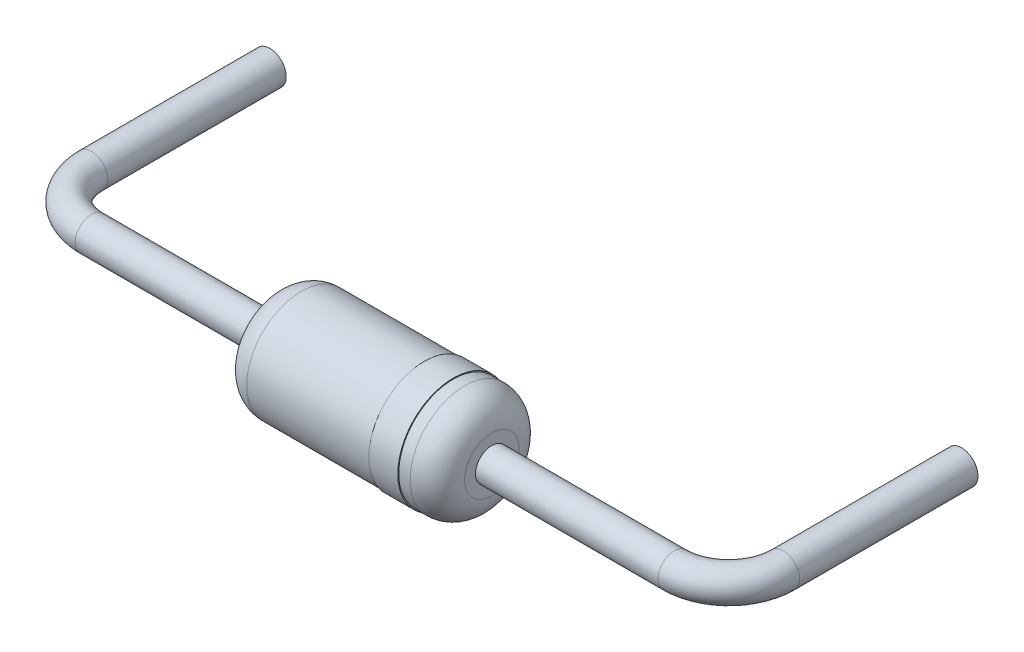
ISO-10303-21;
HEADER;
FILE_DESCRIPTION(('STEP AP214'),'2;1');
FILE_NAME('part.step','',(''),(''),'','','');
FILE_SCHEMA(('AUTOMOTIVE_DESIGN { 1 0 10303 214 1 1 1 1 }'));
ENDSEC;
DATA;
#1=APPLICATION_CONTEXT('core data for automotive mechanical design processes');
#2=APPLICATION_PROTOCOL_DEFINITION('international standard','automotive_design',2000,#1);
#3=PRODUCT_CONTEXT('',#1,'mechanical');
#4=PRODUCT('Part','Part','',(#3));
#5=PRODUCT_RELATED_PRODUCT_CATEGORY('part','',(#4));
#6=PRODUCT_DEFINITION_FORMATION('','',#4);
#7=PRODUCT_DEFINITION_CONTEXT('part definition',#1,'design');
#8=PRODUCT_DEFINITION('design','',#6,#7);
#9=PRODUCT_DEFINITION_SHAPE('','',#8);
#10=(LENGTH_UNIT() NAMED_UNIT(*) SI_UNIT(.MILLI.,.METRE.));
#11=(NAMED_UNIT(*) PLANE_ANGLE_UNIT() SI_UNIT($,.RADIAN.));
#12=(NAMED_UNIT(*) SI_UNIT($,.STERADIAN.) SOLID_ANGLE_UNIT());
#13=UNCERTAINTY_MEASURE_WITH_UNIT(LENGTH_MEASURE(1.E-05),#10,'distance_accuracy_value','');
#14=(GEOMETRIC_REPRESENTATION_CONTEXT(3) GLOBAL_UNCERTAINTY_ASSIGNED_CONTEXT((#13)) GLOBAL_UNIT_ASSIGNED_CONTEXT((#10,
#11,#12)) REPRESENTATION_CONTEXT('',''));
#15=CARTESIAN_POINT('',(0.,0.,0.));
#16=DIRECTION('',(0.,0.,1.));
#17=DIRECTION('',(1.,0.,0.));
#18=AXIS2_PLACEMENT_3D('',#15,#16,#17);
#19=CARTESIAN_POINT('',(42.5404763874384,54.61056134,0.1127));
#20=DIRECTION('',(0.,-1.,0.));
#21=DIRECTION('',(0.,0.,1.));
#22=AXIS2_PLACEMENT_3D('',#19,#20,#21);
#23=TOROIDAL_SURFACE('',#22,1.,0.3);
#24=CARTESIAN_POINT('',(43.5404763874384,54.61056134,0.1127));
#25=DIRECTION('',(0.,0.,-1.));
#26=DIRECTION('',(1.,0.,0.));
#27=AXIS2_PLACEMENT_3D('',#24,#25,#26);
#28=CIRCLE('',#27,0.3);
#29=CARTESIAN_POINT('',(43.2404763874384,54.61056134,0.1127));
#30=VERTEX_POINT('',#29);
#31=EDGE_CURVE('E39',#30,#30,#28,.T.);
#32=ORIENTED_EDGE('',*,*,#31,.F.);
#33=EDGE_LOOP('',(#32));
#34=FACE_BOUND('',#33,.T.);
#35=CARTESIAN_POINT('',(42.5404763874384,54.61056134,1.1127));
#36=DIRECTION('',(1.,0.,0.));
#37=DIRECTION('',(0.,0.,1.));
#38=AXIS2_PLACEMENT_3D('',#35,#36,#37);
#39=CIRCLE('',#38,0.3);
#40=CARTESIAN_POINT('',(42.5404763874384,54.61056134,0.8127));
#41=VERTEX_POINT('',#40);
#42=EDGE_CURVE('E11',#41,#41,#39,.T.);
#43=ORIENTED_EDGE('',*,*,#42,.T.);
#44=EDGE_LOOP('',(#43));
#45=FACE_BOUND('',#44,.T.);
#46=ADVANCED_FACE('F16',(#34,#45),#23,.T.);
#47=CARTESIAN_POINT('',(31.8404763874384,54.61056134,0.1127));
#48=DIRECTION('',(0.,1.,0.));
#49=DIRECTION('',(0.,0.,-1.));
#50=AXIS2_PLACEMENT_3D('',#47,#48,#49);
#51=TOROIDAL_SURFACE('',#50,1.,0.3);
#52=CARTESIAN_POINT('',(30.8404763874384,54.61056134,0.1127));
#53=DIRECTION('',(0.,0.,-1.));
#54=DIRECTION('',(1.,0.,0.));
#55=AXIS2_PLACEMENT_3D('',#52,#53,#54);
#56=CIRCLE('',#55,0.3);
#57=CARTESIAN_POINT('',(31.1404763874384,54.61056134,0.1127));
#58=VERTEX_POINT('',#57);
#59=EDGE_CURVE('E133',#58,#58,#56,.T.);
#60=ORIENTED_EDGE('',*,*,#59,.F.);
#61=EDGE_LOOP('',(#60));
#62=FACE_BOUND('',#61,.T.);
#63=CARTESIAN_POINT('',(31.8404763874384,54.61056134,1.1127));
#64=DIRECTION('',(-1.,0.,0.));
#65=DIRECTION('',(0.,0.,-1.));
#66=AXIS2_PLACEMENT_3D('',#63,#64,#65);
#67=CIRCLE('',#66,0.3);
#68=CARTESIAN_POINT('',(31.8404763874384,54.61056134,0.8127));
#69=VERTEX_POINT('',#68);
#70=EDGE_CURVE('E20',#69,#69,#67,.T.);
#71=ORIENTED_EDGE('',*,*,#70,.T.);
#72=EDGE_LOOP('',(#71));
#73=FACE_BOUND('',#72,.T.);
#74=ADVANCED_FACE('F173',(#62,#73),#51,.T.);
#75=CARTESIAN_POINT('',(30.8404763874384,54.61056134,0.0127000000000011));
#76=DIRECTION('',(0.,0.,-1.));
#77=DIRECTION('',(1.,0.,0.));
#78=AXIS2_PLACEMENT_3D('',#75,#76,#77);
#79=CYLINDRICAL_SURFACE('',#78,0.3);
#80=ORIENTED_EDGE('',*,*,#59,.T.);
#81=EDGE_LOOP('',(#80));
#82=FACE_BOUND('',#81,.T.);
#83=CARTESIAN_POINT('',(30.8404763874384,54.61056134,-3.1623));
#84=DIRECTION('',(0.,0.,1.));
#85=DIRECTION('',(1.,0.,0.));
#86=AXIS2_PLACEMENT_3D('',#83,#84,#85);
#87=CIRCLE('',#86,0.3);
#88=CARTESIAN_POINT('',(31.1404763874384,54.61056134,-3.1623));
#89=VERTEX_POINT('',#88);
#90=EDGE_CURVE('E129',#89,#89,#87,.T.);
#91=ORIENTED_EDGE('',*,*,#90,.T.);
#92=EDGE_LOOP('',(#91));
#93=FACE_BOUND('',#92,.T.);
#94=ADVANCED_FACE('F179',(#82,#93),#79,.T.);
#95=CARTESIAN_POINT('',(43.5404763874384,54.61056134,0.0127000000000011));
#96=DIRECTION('',(0.,0.,-1.));
#97=DIRECTION('',(1.,0.,0.));
#98=AXIS2_PLACEMENT_3D('',#95,#96,#97);
#99=CYLINDRICAL_SURFACE('',#98,0.3);
#100=ORIENTED_EDGE('',*,*,#31,.T.);
#101=EDGE_LOOP('',(#100));
#102=FACE_BOUND('',#101,.T.);
#103=CARTESIAN_POINT('',(43.5404763874384,54.61056134,-3.1623));
#104=DIRECTION('',(0.,0.,1.));
#105=DIRECTION('',(1.,0.,0.));
#106=AXIS2_PLACEMENT_3D('',#103,#104,#105);
#107=CIRCLE('',#106,0.3);
#108=CARTESIAN_POINT('',(43.8404763874384,54.61056134,-3.1623));
#109=VERTEX_POINT('',#108);
#110=EDGE_CURVE('E68',#109,#109,#107,.T.);
#111=ORIENTED_EDGE('',*,*,#110,.T.);
#112=EDGE_LOOP('',(#111));
#113=FACE_BOUND('',#112,.T.);
#114=ADVANCED_FACE('F190',(#102,#113),#99,.T.);
#115=CARTESIAN_POINT('',(38.6904763874384,54.61056134,1.1127));
#116=DIRECTION('',(1.,0.,0.));
#117=DIRECTION('',(0.,0.,1.));
#118=AXIS2_PLACEMENT_3D('',#115,#116,#117);
#119=DEGENERATE_TOROIDAL_SURFACE('',#118,0.5,0.5,.T.);
#120=CARTESIAN_POINT('',(38.6904763874384,54.61056134,1.1127));
#121=DIRECTION('',(1.,0.,0.));
#122=DIRECTION('',(0.,0.,1.));
#123=AXIS2_PLACEMENT_3D('',#120,#121,#122);
#124=CIRCLE('',#123,1.);
#125=CARTESIAN_POINT('',(38.6904763874384,54.61056134,0.112700000000001));
#126=VERTEX_POINT('',#125);
#127=EDGE_CURVE('E79',#126,#126,#124,.T.);
#128=ORIENTED_EDGE('',*,*,#127,.T.);
#129=EDGE_LOOP('',(#128));
#130=FACE_BOUND('',#129,.T.);
#131=CARTESIAN_POINT('',(39.1904763874384,54.61056134,1.1127));
#132=DIRECTION('',(1.,0.,0.));
#133=DIRECTION('',(0.,0.,1.));
#134=AXIS2_PLACEMENT_3D('',#131,#132,#133);
#135=CIRCLE('',#134,0.5);
#136=CARTESIAN_POINT('',(39.1904763874384,54.61056134,1.6127));
#137=VERTEX_POINT('',#136);
#138=EDGE_CURVE('E138',#137,#137,#135,.T.);
#139=ORIENTED_EDGE('',*,*,#138,.F.);
#140=EDGE_LOOP('',(#139));
#141=FACE_BOUND('',#140,.T.);
#142=ADVANCED_FACE('F187',(#130,#141),#119,.T.);
#143=CARTESIAN_POINT('',(37.1904763874384,54.61056134,1.1127));
#144=DIRECTION('',(1.,0.,0.));
#145=DIRECTION('',(0.,0.,1.));
#146=AXIS2_PLACEMENT_3D('',#143,#144,#145);
#147=CYLINDRICAL_SURFACE('',#146,1.);
#148=CARTESIAN_POINT('',(38.4816183716644,54.61056134,1.1127));
#149=DIRECTION('',(1.,0.,0.));
#150=DIRECTION('',(0.,0.,1.));
#151=AXIS2_PLACEMENT_3D('',#148,#149,#150);
#152=CIRCLE('',#151,1.);
#153=CARTESIAN_POINT('',(38.4816183716644,54.61056134,0.112700000000001));
#154=VERTEX_POINT('',#153);
#155=EDGE_CURVE('E124',#154,#154,#152,.T.);
#156=ORIENTED_EDGE('',*,*,#155,.T.);
#157=EDGE_LOOP('',(#156));
#158=FACE_BOUND('',#157,.T.);
#159=ORIENTED_EDGE('',*,*,#127,.F.);
#160=EDGE_LOOP('',(#159));
#161=FACE_BOUND('',#160,.T.);
#162=ADVANCED_FACE('F154',(#158,#161),#147,.T.);
#163=CARTESIAN_POINT('',(35.6904763874384,54.61056134,1.1127));
#164=DIRECTION('',(1.,0.,0.));
#165=DIRECTION('',(0.,0.,1.));
#166=AXIS2_PLACEMENT_3D('',#163,#164,#165);
#167=DEGENERATE_TOROIDAL_SURFACE('',#166,0.5,0.5,.T.);
#168=CARTESIAN_POINT('',(35.1904763874384,54.61056134,1.1127));
#169=DIRECTION('',(1.,0.,0.));
#170=DIRECTION('',(0.,0.,1.));
#171=AXIS2_PLACEMENT_3D('',#168,#169,#170);
#172=CIRCLE('',#171,0.5);
#173=CARTESIAN_POINT('',(35.1904763874384,54.61056134,0.6127));
#174=VERTEX_POINT('',#173);
#175=EDGE_CURVE('E116',#174,#174,#172,.T.);
#176=ORIENTED_EDGE('',*,*,#175,.T.);
#177=EDGE_LOOP('',(#176));
#178=FACE_BOUND('',#177,.T.);
#179=CARTESIAN_POINT('',(35.6904763874384,54.61056134,1.1127));
#180=DIRECTION('',(1.,0.,0.));
#181=DIRECTION('',(0.,0.,1.));
#182=AXIS2_PLACEMENT_3D('',#179,#180,#181);
#183=CIRCLE('',#182,1.);
#184=CARTESIAN_POINT('',(35.6904763874384,54.61056134,2.1127));
#185=VERTEX_POINT('',#184);
#186=EDGE_CURVE('E112',#185,#185,#183,.T.);
#187=ORIENTED_EDGE('',*,*,#186,.F.);
#188=EDGE_LOOP('',(#187));
#189=FACE_BOUND('',#188,.T.);
#190=ADVANCED_FACE('F113',(#178,#189),#167,.T.);
#191=CARTESIAN_POINT('',(37.1904763874384,54.61056134,1.1127));
#192=DIRECTION('',(1.,0.,0.));
#193=DIRECTION('',(0.,0.,1.));
#194=AXIS2_PLACEMENT_3D('',#191,#192,#193);
#195=CYLINDRICAL_SURFACE('',#194,1.);
#196=ORIENTED_EDGE('',*,*,#186,.T.);
#197=EDGE_LOOP('',(#196));
#198=FACE_BOUND('',#197,.T.);
#199=CARTESIAN_POINT('',(37.9495502227754,54.61056134,1.1127));
#200=DIRECTION('',(-1.,0.,0.));
#201=DIRECTION('',(0.,0.,1.));
#202=AXIS2_PLACEMENT_3D('',#199,#200,#201);
#203=CIRCLE('',#202,1.);
#204=CARTESIAN_POINT('',(37.9495502227754,54.61056134,2.1127));
#205=VERTEX_POINT('',#204);
#206=EDGE_CURVE('E106',#205,#205,#203,.T.);
#207=ORIENTED_EDGE('',*,*,#206,.T.);
#208=EDGE_LOOP('',(#207));
#209=FACE_BOUND('',#208,.T.);
#210=ADVANCED_FACE('F193',(#198,#209),#195,.T.);
#211=CARTESIAN_POINT('',(38.2155842972194,54.61056134,1.1127));
#212=DIRECTION('',(1.,0.,0.));
#213=DIRECTION('',(0.,0.,1.));
#214=AXIS2_PLACEMENT_3D('',#211,#212,#213);
#215=CYLINDRICAL_SURFACE('',#214,1.017447467414);
#216=CARTESIAN_POINT('',(37.9495502227754,54.61056134,1.1127));
#217=DIRECTION('',(1.,0.,0.));
#218=DIRECTION('',(0.,0.,1.));
#219=AXIS2_PLACEMENT_3D('',#216,#217,#218);
#220=CIRCLE('',#219,1.017447467414);
#221=CARTESIAN_POINT('',(37.9495502227754,54.61056134,0.0952525325860012));
#222=VERTEX_POINT('',#221);
#223=EDGE_CURVE('E125',#222,#222,#220,.T.);
#224=ORIENTED_EDGE('',*,*,#223,.T.);
#225=EDGE_LOOP('',(#224));
#226=FACE_BOUND('',#225,.T.);
#227=CARTESIAN_POINT('',(38.4816183716644,54.61056134,1.1127));
#228=DIRECTION('',(1.,0.,0.));
#229=DIRECTION('',(0.,0.,1.));
#230=AXIS2_PLACEMENT_3D('',#227,#228,#229);
#231=CIRCLE('',#230,1.017447467414);
#232=CARTESIAN_POINT('',(38.4816183716644,54.61056134,2.130147467414));
#233=VERTEX_POINT('',#232);
#234=EDGE_CURVE('E137',#233,#233,#231,.T.);
#235=ORIENTED_EDGE('',*,*,#234,.F.);
#236=EDGE_LOOP('',(#235));
#237=FACE_BOUND('',#236,.T.);
#238=ADVANCED_FACE('F185',(#226,#237),#215,.T.);
#239=CARTESIAN_POINT('',(42.5404763874384,54.61056134,1.1127));
#240=DIRECTION('',(-1.,0.,0.));
#241=DIRECTION('',(0.,0.,1.));
#242=AXIS2_PLACEMENT_3D('',#239,#240,#241);
#243=CYLINDRICAL_SURFACE('',#242,0.3);
#244=ORIENTED_EDGE('',*,*,#42,.F.);
#245=EDGE_LOOP('',(#244));
#246=FACE_BOUND('',#245,.T.);
#247=CARTESIAN_POINT('',(39.1904763874384,54.61056134,1.1127));
#248=DIRECTION('',(-1.,0.,0.));
#249=DIRECTION('',(0.,0.,1.));
#250=AXIS2_PLACEMENT_3D('',#247,#248,#249);
#251=CIRCLE('',#250,0.3);
#252=CARTESIAN_POINT('',(39.1904763874384,54.61056134,1.4127));
#253=VERTEX_POINT('',#252);
#254=EDGE_CURVE('E142',#253,#253,#251,.T.);
#255=ORIENTED_EDGE('',*,*,#254,.F.);
#256=EDGE_LOOP('',(#255));
#257=FACE_BOUND('',#256,.T.);
#258=ADVANCED_FACE('F167',(#246,#257),#243,.T.);
#259=CARTESIAN_POINT('',(31.8404763874384,54.61056134,1.1127));
#260=DIRECTION('',(1.,0.,0.));
#261=DIRECTION('',(0.,0.,-1.));
#262=AXIS2_PLACEMENT_3D('',#259,#260,#261);
#263=CYLINDRICAL_SURFACE('',#262,0.3);
#264=ORIENTED_EDGE('',*,*,#70,.F.);
#265=EDGE_LOOP('',(#264));
#266=FACE_BOUND('',#265,.T.);
#267=CARTESIAN_POINT('',(35.1904763874384,54.61056134,1.1127));
#268=DIRECTION('',(1.,0.,0.));
#269=DIRECTION('',(0.,0.,-1.));
#270=AXIS2_PLACEMENT_3D('',#267,#268,#269);
#271=CIRCLE('',#270,0.3);
#272=CARTESIAN_POINT('',(35.1904763874384,54.61056134,0.8127));
#273=VERTEX_POINT('',#272);
#274=EDGE_CURVE('E211',#273,#273,#271,.T.);
#275=ORIENTED_EDGE('',*,*,#274,.F.);
#276=EDGE_LOOP('',(#275));
#277=FACE_BOUND('',#276,.T.);
#278=ADVANCED_FACE('F158',(#266,#277),#263,.T.);
#279=CARTESIAN_POINT('',(38.4816183716644,54.61056134,2.102450753973));
#280=DIRECTION('',(1.,0.,0.));
#281=DIRECTION('',(0.,0.,1.));
#282=AXIS2_PLACEMENT_3D('',#279,#280,#281);
#283=PLANE('',#282);
#284=ORIENTED_EDGE('',*,*,#234,.T.);
#285=EDGE_LOOP('',(#284));
#286=FACE_BOUND('',#285,.T.);
#287=ORIENTED_EDGE('',*,*,#155,.F.);
#288=EDGE_LOOP('',(#287));
#289=FACE_BOUND('',#288,.T.);
#290=ADVANCED_FACE('F156',(#286,#289),#283,.T.);
#291=CARTESIAN_POINT('',(37.9495502227754,54.61056134,2.102450753973));
#292=DIRECTION('',(-1.,0.,0.));
#293=DIRECTION('',(0.,-1.,0.));
#294=AXIS2_PLACEMENT_3D('',#291,#292,#293);
#295=PLANE('',#294);
#296=ORIENTED_EDGE('',*,*,#223,.F.);
#297=EDGE_LOOP('',(#296));
#298=FACE_BOUND('',#297,.T.);
#299=ORIENTED_EDGE('',*,*,#206,.F.);
#300=EDGE_LOOP('',(#299));
#301=FACE_BOUND('',#300,.T.);
#302=ADVANCED_FACE('F18',(#298,#301),#295,.T.);
#303=CARTESIAN_POINT('',(39.1904763874384,54.61056134,1.3627));
#304=DIRECTION('',(1.,0.,0.));
#305=DIRECTION('',(0.,0.,1.));
#306=AXIS2_PLACEMENT_3D('',#303,#304,#305);
#307=PLANE('',#306);
#308=ORIENTED_EDGE('',*,*,#138,.T.);
#309=EDGE_LOOP('',(#308));
#310=FACE_BOUND('',#309,.T.);
#311=ORIENTED_EDGE('',*,*,#254,.T.);
#312=EDGE_LOOP('',(#311));
#313=FACE_BOUND('',#312,.T.);
#314=ADVANCED_FACE('F165',(#310,#313),#307,.T.);
#315=CARTESIAN_POINT('',(35.1904763874384,54.61056134,1.3627));
#316=DIRECTION('',(-1.,0.,0.));
#317=DIRECTION('',(0.,-1.,0.));
#318=AXIS2_PLACEMENT_3D('',#315,#316,#317);
#319=PLANE('',#318);
#320=ORIENTED_EDGE('',*,*,#175,.F.);
#321=EDGE_LOOP('',(#320));
#322=FACE_BOUND('',#321,.T.);
#323=ORIENTED_EDGE('',*,*,#274,.T.);
#324=EDGE_LOOP('',(#323));
#325=FACE_BOUND('',#324,.T.);
#326=ADVANCED_FACE('F197',(#322,#325),#319,.T.);
#327=CARTESIAN_POINT('',(43.5404763874384,54.61056134,-3.1623));
#328=DIRECTION('',(0.,0.,-1.));
#329=DIRECTION('',(0.,1.,0.));
#330=AXIS2_PLACEMENT_3D('',#327,#328,#329);
#331=PLANE('',#330);
#332=ORIENTED_EDGE('',*,*,#110,.F.);
#333=EDGE_LOOP('',(#332));
#334=FACE_BOUND('',#333,.T.);
#335=ADVANCED_FACE('F201',(#334),#331,.T.);
#336=CARTESIAN_POINT('',(30.8404763874384,54.61056134,-3.1623));
#337=DIRECTION('',(0.,0.,-1.));
#338=DIRECTION('',(0.,1.,0.));
#339=AXIS2_PLACEMENT_3D('',#336,#337,#338);
#340=PLANE('',#339);
#341=ORIENTED_EDGE('',*,*,#90,.F.);
#342=EDGE_LOOP('',(#341));
#343=FACE_BOUND('',#342,.T.);
#344=ADVANCED_FACE('F199',(#343),#340,.T.);
#345=CLOSED_SHELL('',(#46,#74,#94,#114,#142,#162,#190,#210,#238,#258,#278,#290,#302,#314,#326,
#335,#344));
#346=MANIFOLD_SOLID_BREP('B1',#345);
#347=ADVANCED_BREP_SHAPE_REPRESENTATION('',(#18,#346),#14);
#348=SHAPE_DEFINITION_REPRESENTATION(#9,#347);
ENDSEC;
END-ISO-10303-21;
